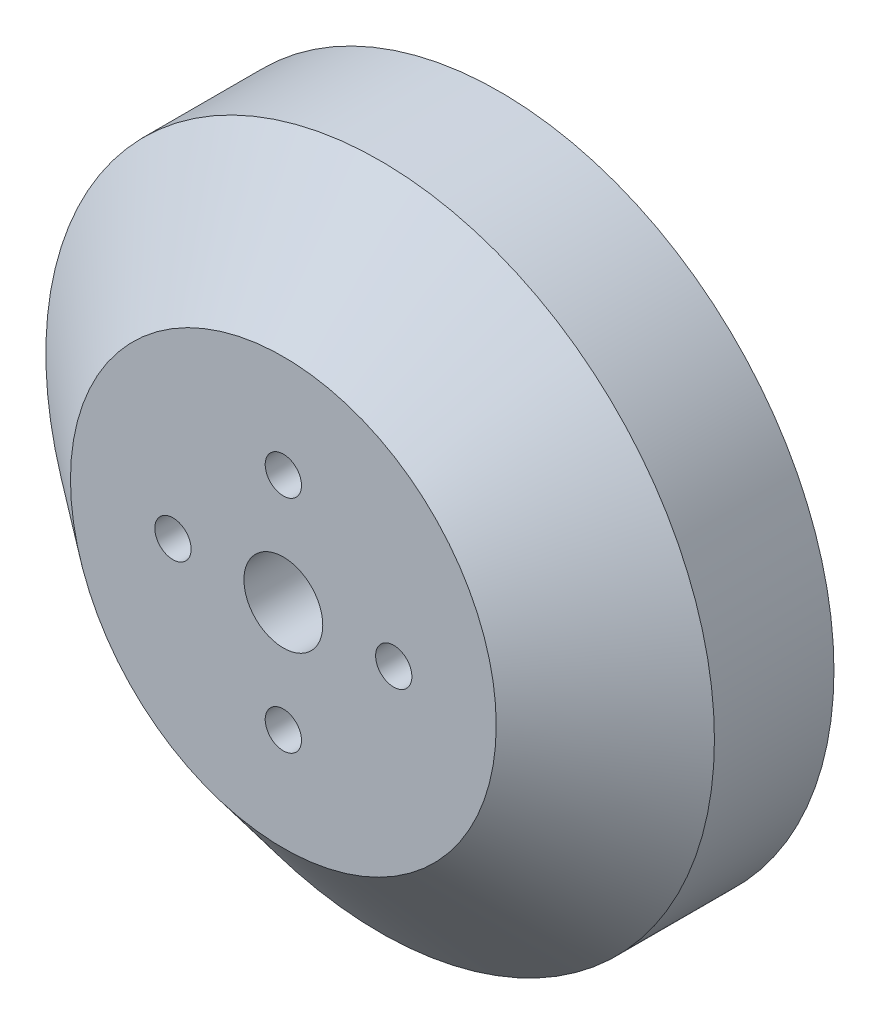
ISO-10303-21;
HEADER;
FILE_DESCRIPTION(('STEP AP214'),'2;1');
FILE_NAME('part.step','',(''),(''),'','','');
FILE_SCHEMA(('AUTOMOTIVE_DESIGN { 1 0 10303 214 1 1 1 1 }'));
ENDSEC;
DATA;
#1=APPLICATION_CONTEXT('core data for automotive mechanical design processes');
#2=APPLICATION_PROTOCOL_DEFINITION('international standard','automotive_design',2000,#1);
#3=PRODUCT_CONTEXT('',#1,'mechanical');
#4=PRODUCT('Part','Part','',(#3));
#5=PRODUCT_RELATED_PRODUCT_CATEGORY('part','',(#4));
#6=PRODUCT_DEFINITION_FORMATION('','',#4);
#7=PRODUCT_DEFINITION_CONTEXT('part definition',#1,'design');
#8=PRODUCT_DEFINITION('design','',#6,#7);
#9=PRODUCT_DEFINITION_SHAPE('','',#8);
#10=(LENGTH_UNIT() NAMED_UNIT(*) SI_UNIT(.MILLI.,.METRE.));
#11=(NAMED_UNIT(*) PLANE_ANGLE_UNIT() SI_UNIT($,.RADIAN.));
#12=(NAMED_UNIT(*) SI_UNIT($,.STERADIAN.) SOLID_ANGLE_UNIT());
#13=UNCERTAINTY_MEASURE_WITH_UNIT(LENGTH_MEASURE(1.E-05),#10,'distance_accuracy_value','');
#14=(GEOMETRIC_REPRESENTATION_CONTEXT(3) GLOBAL_UNCERTAINTY_ASSIGNED_CONTEXT((#13)) GLOBAL_UNIT_ASSIGNED_CONTEXT((#10,
#11,#12)) REPRESENTATION_CONTEXT('',''));
#15=CARTESIAN_POINT('',(0.,0.,0.));
#16=DIRECTION('',(0.,0.,1.));
#17=DIRECTION('',(1.,0.,0.));
#18=AXIS2_PLACEMENT_3D('',#15,#16,#17);
#19=CARTESIAN_POINT('',(0.,0.,7.));
#20=DIRECTION('',(0.,0.,1.));
#21=DIRECTION('',(1.,0.,0.));
#22=AXIS2_PLACEMENT_3D('',#19,#20,#21);
#23=PLANE('',#22);
#24=CARTESIAN_POINT('',(-7.,0.,7.));
#25=DIRECTION('',(0.,0.,1.));
#26=DIRECTION('',(1.,0.,0.));
#27=AXIS2_PLACEMENT_3D('',#24,#25,#26);
#28=CIRCLE('',#27,1.15);
#29=CARTESIAN_POINT('',(-5.85,0.,7.));
#30=VERTEX_POINT('',#29);
#31=EDGE_CURVE('E76',#30,#30,#28,.T.);
#32=ORIENTED_EDGE('',*,*,#31,.F.);
#33=EDGE_LOOP('',(#32));
#34=FACE_BOUND('',#33,.T.);
#35=CARTESIAN_POINT('',(0.,-7.,7.));
#36=DIRECTION('',(0.,0.,1.));
#37=DIRECTION('',(1.,0.,0.));
#38=AXIS2_PLACEMENT_3D('',#35,#36,#37);
#39=CIRCLE('',#38,1.15);
#40=CARTESIAN_POINT('',(1.15,-7.,7.));
#41=VERTEX_POINT('',#40);
#42=EDGE_CURVE('E62',#41,#41,#39,.T.);
#43=ORIENTED_EDGE('',*,*,#42,.F.);
#44=EDGE_LOOP('',(#43));
#45=FACE_BOUND('',#44,.T.);
#46=CARTESIAN_POINT('',(0.,0.,7.));
#47=DIRECTION('',(0.,0.,1.));
#48=DIRECTION('',(1.,0.,0.));
#49=AXIS2_PLACEMENT_3D('',#46,#47,#48);
#50=CIRCLE('',#49,13.5);
#51=CARTESIAN_POINT('',(13.5,0.,7.));
#52=VERTEX_POINT('',#51);
#53=EDGE_CURVE('E111',#52,#52,#50,.T.);
#54=ORIENTED_EDGE('',*,*,#53,.T.);
#55=EDGE_LOOP('',(#54));
#56=FACE_BOUND('',#55,.T.);
#57=CARTESIAN_POINT('',(0.,7.,7.));
#58=DIRECTION('',(0.,0.,1.));
#59=DIRECTION('',(1.,0.,0.));
#60=AXIS2_PLACEMENT_3D('',#57,#58,#59);
#61=CIRCLE('',#60,1.15);
#62=CARTESIAN_POINT('',(1.15,7.,7.));
#63=VERTEX_POINT('',#62);
#64=EDGE_CURVE('E51',#63,#63,#61,.T.);
#65=ORIENTED_EDGE('',*,*,#64,.F.);
#66=EDGE_LOOP('',(#65));
#67=FACE_BOUND('',#66,.T.);
#68=CARTESIAN_POINT('',(7.,0.,7.));
#69=DIRECTION('',(0.,0.,1.));
#70=DIRECTION('',(1.,0.,0.));
#71=AXIS2_PLACEMENT_3D('',#68,#69,#70);
#72=CIRCLE('',#71,1.15);
#73=CARTESIAN_POINT('',(8.15,0.,7.));
#74=VERTEX_POINT('',#73);
#75=EDGE_CURVE('E68',#74,#74,#72,.T.);
#76=ORIENTED_EDGE('',*,*,#75,.F.);
#77=EDGE_LOOP('',(#76));
#78=FACE_BOUND('',#77,.T.);
#79=CARTESIAN_POINT('',(0.,0.,7.));
#80=DIRECTION('',(0.,0.,1.));
#81=DIRECTION('',(1.,0.,0.));
#82=AXIS2_PLACEMENT_3D('',#79,#80,#81);
#83=CIRCLE('',#82,2.5);
#84=CARTESIAN_POINT('',(2.5,0.,7.));
#85=VERTEX_POINT('',#84);
#86=EDGE_CURVE('E84',#85,#85,#83,.T.);
#87=ORIENTED_EDGE('',*,*,#86,.F.);
#88=EDGE_LOOP('',(#87));
#89=FACE_BOUND('',#88,.T.);
#90=ADVANCED_FACE('F43',(#34,#45,#56,#67,#78,#89),#23,.T.);
#91=CARTESIAN_POINT('',(0.,0.,0.));
#92=DIRECTION('',(0.,0.,1.));
#93=DIRECTION('',(1.,0.,0.));
#94=AXIS2_PLACEMENT_3D('',#91,#92,#93);
#95=PLANE('',#94);
#96=CARTESIAN_POINT('',(0.,0.,0.));
#97=DIRECTION('',(0.,0.,1.));
#98=DIRECTION('',(1.,0.,0.));
#99=AXIS2_PLACEMENT_3D('',#96,#97,#98);
#100=CIRCLE('',#99,13.5);
#101=CARTESIAN_POINT('',(13.5,0.,0.));
#102=VERTEX_POINT('',#101);
#103=EDGE_CURVE('E10',#102,#102,#100,.T.);
#104=ORIENTED_EDGE('',*,*,#103,.F.);
#105=EDGE_LOOP('',(#104));
#106=FACE_BOUND('',#105,.T.);
#107=CARTESIAN_POINT('',(0.,7.,0.));
#108=DIRECTION('',(0.,0.,1.));
#109=DIRECTION('',(1.,0.,0.));
#110=AXIS2_PLACEMENT_3D('',#107,#108,#109);
#111=CIRCLE('',#110,1.15);
#112=CARTESIAN_POINT('',(1.15,7.,0.));
#113=VERTEX_POINT('',#112);
#114=EDGE_CURVE('E56',#113,#113,#111,.T.);
#115=ORIENTED_EDGE('',*,*,#114,.T.);
#116=EDGE_LOOP('',(#115));
#117=FACE_BOUND('',#116,.T.);
#118=CARTESIAN_POINT('',(0.,-7.,0.));
#119=DIRECTION('',(0.,0.,1.));
#120=DIRECTION('',(1.,0.,0.));
#121=AXIS2_PLACEMENT_3D('',#118,#119,#120);
#122=CIRCLE('',#121,1.15);
#123=CARTESIAN_POINT('',(1.15,-7.,0.));
#124=VERTEX_POINT('',#123);
#125=EDGE_CURVE('E64',#124,#124,#122,.T.);
#126=ORIENTED_EDGE('',*,*,#125,.T.);
#127=EDGE_LOOP('',(#126));
#128=FACE_BOUND('',#127,.T.);
#129=CARTESIAN_POINT('',(7.,0.,0.));
#130=DIRECTION('',(0.,0.,1.));
#131=DIRECTION('',(1.,0.,0.));
#132=AXIS2_PLACEMENT_3D('',#129,#130,#131);
#133=CIRCLE('',#132,1.15);
#134=CARTESIAN_POINT('',(8.15,0.,0.));
#135=VERTEX_POINT('',#134);
#136=EDGE_CURVE('E72',#135,#135,#133,.T.);
#137=ORIENTED_EDGE('',*,*,#136,.T.);
#138=EDGE_LOOP('',(#137));
#139=FACE_BOUND('',#138,.T.);
#140=CARTESIAN_POINT('',(-7.,0.,0.));
#141=DIRECTION('',(0.,0.,1.));
#142=DIRECTION('',(1.,0.,0.));
#143=AXIS2_PLACEMENT_3D('',#140,#141,#142);
#144=CIRCLE('',#143,1.15);
#145=CARTESIAN_POINT('',(-5.85,0.,0.));
#146=VERTEX_POINT('',#145);
#147=EDGE_CURVE('E80',#146,#146,#144,.T.);
#148=ORIENTED_EDGE('',*,*,#147,.T.);
#149=EDGE_LOOP('',(#148));
#150=FACE_BOUND('',#149,.T.);
#151=CARTESIAN_POINT('',(0.,0.,0.));
#152=DIRECTION('',(0.,0.,1.));
#153=DIRECTION('',(1.,0.,0.));
#154=AXIS2_PLACEMENT_3D('',#151,#152,#153);
#155=CIRCLE('',#154,2.5);
#156=CARTESIAN_POINT('',(2.5,0.,0.));
#157=VERTEX_POINT('',#156);
#158=EDGE_CURVE('E88',#157,#157,#155,.T.);
#159=ORIENTED_EDGE('',*,*,#158,.T.);
#160=EDGE_LOOP('',(#159));
#161=FACE_BOUND('',#160,.T.);
#162=ADVANCED_FACE('F45',(#106,#117,#128,#139,#150,#161),#95,.F.);
#163=CARTESIAN_POINT('',(0.,7.,7.));
#164=DIRECTION('',(0.,0.,-1.));
#165=DIRECTION('',(-1.,0.,0.));
#166=AXIS2_PLACEMENT_3D('',#163,#164,#165);
#167=CYLINDRICAL_SURFACE('',#166,1.15);
#168=ORIENTED_EDGE('',*,*,#64,.T.);
#169=EDGE_LOOP('',(#168));
#170=FACE_BOUND('',#169,.T.);
#171=ORIENTED_EDGE('',*,*,#114,.F.);
#172=EDGE_LOOP('',(#171));
#173=FACE_BOUND('',#172,.T.);
#174=ADVANCED_FACE('F157',(#170,#173),#167,.F.);
#175=CARTESIAN_POINT('',(0.,-7.,7.));
#176=DIRECTION('',(0.,0.,-1.));
#177=DIRECTION('',(-1.,0.,0.));
#178=AXIS2_PLACEMENT_3D('',#175,#176,#177);
#179=CYLINDRICAL_SURFACE('',#178,1.15);
#180=ORIENTED_EDGE('',*,*,#42,.T.);
#181=EDGE_LOOP('',(#180));
#182=FACE_BOUND('',#181,.T.);
#183=ORIENTED_EDGE('',*,*,#125,.F.);
#184=EDGE_LOOP('',(#183));
#185=FACE_BOUND('',#184,.T.);
#186=ADVANCED_FACE('F164',(#182,#185),#179,.F.);
#187=CARTESIAN_POINT('',(7.,0.,7.));
#188=DIRECTION('',(0.,0.,-1.));
#189=DIRECTION('',(-1.,0.,0.));
#190=AXIS2_PLACEMENT_3D('',#187,#188,#189);
#191=CYLINDRICAL_SURFACE('',#190,1.15);
#192=ORIENTED_EDGE('',*,*,#75,.T.);
#193=EDGE_LOOP('',(#192));
#194=FACE_BOUND('',#193,.T.);
#195=ORIENTED_EDGE('',*,*,#136,.F.);
#196=EDGE_LOOP('',(#195));
#197=FACE_BOUND('',#196,.T.);
#198=ADVANCED_FACE('F167',(#194,#197),#191,.F.);
#199=CARTESIAN_POINT('',(-7.,0.,7.));
#200=DIRECTION('',(0.,0.,-1.));
#201=DIRECTION('',(-1.,0.,0.));
#202=AXIS2_PLACEMENT_3D('',#199,#200,#201);
#203=CYLINDRICAL_SURFACE('',#202,1.15);
#204=ORIENTED_EDGE('',*,*,#31,.T.);
#205=EDGE_LOOP('',(#204));
#206=FACE_BOUND('',#205,.T.);
#207=ORIENTED_EDGE('',*,*,#147,.F.);
#208=EDGE_LOOP('',(#207));
#209=FACE_BOUND('',#208,.T.);
#210=ADVANCED_FACE('F149',(#206,#209),#203,.F.);
#211=CARTESIAN_POINT('',(0.,0.,7.));
#212=DIRECTION('',(0.,0.,-1.));
#213=DIRECTION('',(-1.,0.,0.));
#214=AXIS2_PLACEMENT_3D('',#211,#212,#213);
#215=CYLINDRICAL_SURFACE('',#214,2.5);
#216=ORIENTED_EDGE('',*,*,#86,.T.);
#217=EDGE_LOOP('',(#216));
#218=FACE_BOUND('',#217,.T.);
#219=ORIENTED_EDGE('',*,*,#158,.F.);
#220=EDGE_LOOP('',(#219));
#221=FACE_BOUND('',#220,.T.);
#222=ADVANCED_FACE('F144',(#218,#221),#215,.F.);
#223=CARTESIAN_POINT('',(0.,0.,0.));
#224=DIRECTION('',(0.,0.,-1.));
#225=DIRECTION('',(-1.,0.,0.));
#226=AXIS2_PLACEMENT_3D('',#223,#224,#225);
#227=CONICAL_SURFACE('',#226,13.5,0.897747512903935);
#228=CARTESIAN_POINT('',(0.,0.,-4.78337195077152));
#229=DIRECTION('',(0.,0.,1.));
#230=DIRECTION('',(1.,0.,0.));
#231=AXIS2_PLACEMENT_3D('',#228,#229,#230);
#232=CIRCLE('',#231,19.5);
#233=CARTESIAN_POINT('',(19.5,0.,-4.78337195077152));
#234=VERTEX_POINT('',#233);
#235=EDGE_CURVE('E92',#234,#234,#232,.T.);
#236=ORIENTED_EDGE('',*,*,#235,.F.);
#237=EDGE_LOOP('',(#236));
#238=FACE_BOUND('',#237,.T.);
#239=ORIENTED_EDGE('',*,*,#103,.T.);
#240=EDGE_LOOP('',(#239));
#241=FACE_BOUND('',#240,.T.);
#242=ADVANCED_FACE('F139',(#238,#241),#227,.F.);
#243=CARTESIAN_POINT('',(0.,0.,0.));
#244=DIRECTION('',(0.,0.,1.));
#245=DIRECTION('',(1.,0.,0.));
#246=AXIS2_PLACEMENT_3D('',#243,#244,#245);
#247=CYLINDRICAL_SURFACE('',#246,19.5);
#248=CARTESIAN_POINT('',(0.,0.,-6.71789082731206));
#249=DIRECTION('',(0.,0.,1.));
#250=DIRECTION('',(1.,0.,0.));
#251=AXIS2_PLACEMENT_3D('',#248,#249,#250);
#252=CIRCLE('',#251,19.5);
#253=CARTESIAN_POINT('',(19.5,0.,-6.71789082731206));
#254=VERTEX_POINT('',#253);
#255=EDGE_CURVE('E99',#254,#254,#252,.T.);
#256=ORIENTED_EDGE('',*,*,#255,.F.);
#257=EDGE_LOOP('',(#256));
#258=FACE_BOUND('',#257,.T.);
#259=ORIENTED_EDGE('',*,*,#235,.T.);
#260=EDGE_LOOP('',(#259));
#261=FACE_BOUND('',#260,.T.);
#262=ADVANCED_FACE('F133',(#258,#261),#247,.F.);
#263=CARTESIAN_POINT('',(0.,21.1993315373481,-6.71789082731206));
#264=DIRECTION('',(0.,0.,1.));
#265=DIRECTION('',(1.,0.,0.));
#266=AXIS2_PLACEMENT_3D('',#263,#264,#265);
#267=PLANE('',#266);
#268=CARTESIAN_POINT('',(0.,0.,-6.71789082731206));
#269=DIRECTION('',(0.,0.,1.));
#270=DIRECTION('',(1.,0.,0.));
#271=AXIS2_PLACEMENT_3D('',#268,#269,#270);
#272=CIRCLE('',#271,21.1993315373481);
#273=CARTESIAN_POINT('',(21.1993315373481,0.,-6.71789082731206));
#274=VERTEX_POINT('',#273);
#275=EDGE_CURVE('E103',#274,#274,#272,.T.);
#276=ORIENTED_EDGE('',*,*,#275,.F.);
#277=EDGE_LOOP('',(#276));
#278=FACE_BOUND('',#277,.T.);
#279=ORIENTED_EDGE('',*,*,#255,.T.);
#280=EDGE_LOOP('',(#279));
#281=FACE_BOUND('',#280,.T.);
#282=ADVANCED_FACE('F127',(#278,#281),#267,.F.);
#283=CARTESIAN_POINT('',(0.,0.,0.));
#284=DIRECTION('',(0.,0.,1.));
#285=DIRECTION('',(1.,0.,0.));
#286=AXIS2_PLACEMENT_3D('',#283,#284,#285);
#287=CYLINDRICAL_SURFACE('',#286,21.1993315373481);
#288=CARTESIAN_POINT('',(0.,0.,0.86187224742644));
#289=DIRECTION('',(0.,0.,1.));
#290=DIRECTION('',(1.,0.,0.));
#291=AXIS2_PLACEMENT_3D('',#288,#289,#290);
#292=CIRCLE('',#291,21.1993315373481);
#293=CARTESIAN_POINT('',(21.1993315373481,0.,0.86187224742644));
#294=VERTEX_POINT('',#293);
#295=EDGE_CURVE('E107',#294,#294,#292,.T.);
#296=ORIENTED_EDGE('',*,*,#295,.F.);
#297=EDGE_LOOP('',(#296));
#298=FACE_BOUND('',#297,.T.);
#299=ORIENTED_EDGE('',*,*,#275,.T.);
#300=EDGE_LOOP('',(#299));
#301=FACE_BOUND('',#300,.T.);
#302=ADVANCED_FACE('F121',(#298,#301),#287,.T.);
#303=CARTESIAN_POINT('',(0.,0.,0.86187224742644));
#304=DIRECTION('',(0.,0.,-1.));
#305=DIRECTION('',(-1.,0.,0.));
#306=AXIS2_PLACEMENT_3D('',#303,#304,#305);
#307=CONICAL_SURFACE('',#306,21.1993315373481,0.897747512903935);
#308=ORIENTED_EDGE('',*,*,#53,.F.);
#309=EDGE_LOOP('',(#308));
#310=FACE_BOUND('',#309,.T.);
#311=ORIENTED_EDGE('',*,*,#295,.T.);
#312=EDGE_LOOP('',(#311));
#313=FACE_BOUND('',#312,.T.);
#314=ADVANCED_FACE('F118',(#310,#313),#307,.T.);
#315=CLOSED_SHELL('',(#90,#162,#174,#186,#198,#210,#222,#242,#262,#282,#302,#314));
#316=MANIFOLD_SOLID_BREP('B2',#315);
#317=ADVANCED_BREP_SHAPE_REPRESENTATION('',(#18,#316),#14);
#318=SHAPE_DEFINITION_REPRESENTATION(#9,#317);
ENDSEC;
END-ISO-10303-21;
